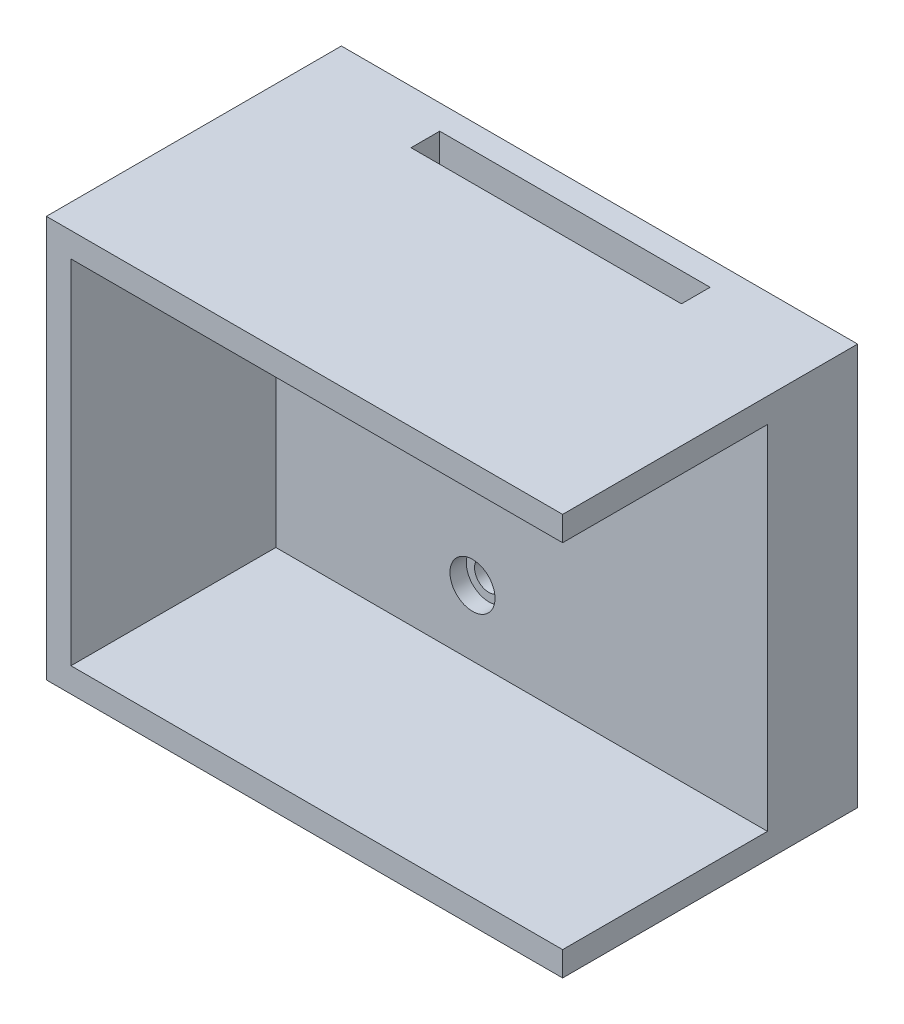
ISO-10303-21;
HEADER;
FILE_DESCRIPTION(('STEP AP214'),'2;1');
FILE_NAME('part.step','',(''),(''),'','','');
FILE_SCHEMA(('AUTOMOTIVE_DESIGN { 1 0 10303 214 1 1 1 1 }'));
ENDSEC;
DATA;
#1=APPLICATION_CONTEXT('core data for automotive mechanical design processes');
#2=APPLICATION_PROTOCOL_DEFINITION('international standard','automotive_design',2000,#1);
#3=PRODUCT_CONTEXT('',#1,'mechanical');
#4=PRODUCT('Part','Part','',(#3));
#5=PRODUCT_RELATED_PRODUCT_CATEGORY('part','',(#4));
#6=PRODUCT_DEFINITION_FORMATION('','',#4);
#7=PRODUCT_DEFINITION_CONTEXT('part definition',#1,'design');
#8=PRODUCT_DEFINITION('design','',#6,#7);
#9=PRODUCT_DEFINITION_SHAPE('','',#8);
#10=(LENGTH_UNIT() NAMED_UNIT(*) SI_UNIT(.MILLI.,.METRE.));
#11=(NAMED_UNIT(*) PLANE_ANGLE_UNIT() SI_UNIT($,.RADIAN.));
#12=(NAMED_UNIT(*) SI_UNIT($,.STERADIAN.) SOLID_ANGLE_UNIT());
#13=UNCERTAINTY_MEASURE_WITH_UNIT(LENGTH_MEASURE(1.E-05),#10,'distance_accuracy_value','');
#14=(GEOMETRIC_REPRESENTATION_CONTEXT(3) GLOBAL_UNCERTAINTY_ASSIGNED_CONTEXT((#13)) GLOBAL_UNIT_ASSIGNED_CONTEXT((#10,
#11,#12)) REPRESENTATION_CONTEXT('',''));
#15=CARTESIAN_POINT('',(0.,0.,0.));
#16=DIRECTION('',(0.,0.,1.));
#17=DIRECTION('',(1.,0.,0.));
#18=AXIS2_PLACEMENT_3D('',#15,#16,#17);
#19=CARTESIAN_POINT('',(-26.,35.,-11.));
#20=DIRECTION('',(0.,0.,1.));
#21=DIRECTION('',(1.,0.,0.));
#22=AXIS2_PLACEMENT_3D('',#19,#20,#21);
#23=CYLINDRICAL_SURFACE('',#22,1.75);
#24=CARTESIAN_POINT('',(-26.,35.,-4.5));
#25=DIRECTION('',(0.,0.,1.));
#26=DIRECTION('',(1.,0.,0.));
#27=AXIS2_PLACEMENT_3D('',#24,#25,#26);
#28=CIRCLE('',#27,1.75);
#29=CARTESIAN_POINT('',(-24.25,35.,-4.5));
#30=VERTEX_POINT('',#29);
#31=EDGE_CURVE('E207',#30,#30,#28,.F.);
#32=ORIENTED_EDGE('',*,*,#31,.T.);
#33=EDGE_LOOP('',(#32));
#34=FACE_BOUND('',#33,.T.);
#35=CARTESIAN_POINT('',(-26.,35.,-2.));
#36=DIRECTION('',(0.,0.,1.));
#37=DIRECTION('',(1.,0.,0.));
#38=AXIS2_PLACEMENT_3D('',#35,#36,#37);
#39=CIRCLE('',#38,1.75);
#40=CARTESIAN_POINT('',(-24.25,35.,-2.));
#41=VERTEX_POINT('',#40);
#42=EDGE_CURVE('E218',#41,#41,#39,.T.);
#43=ORIENTED_EDGE('',*,*,#42,.T.);
#44=EDGE_LOOP('',(#43));
#45=FACE_BOUND('',#44,.T.);
#46=ADVANCED_FACE('F43',(#34,#45),#23,.F.);
#47=CARTESIAN_POINT('',(-26.,8.,-11.));
#48=DIRECTION('',(0.,0.,1.));
#49=DIRECTION('',(1.,0.,0.));
#50=AXIS2_PLACEMENT_3D('',#47,#48,#49);
#51=CYLINDRICAL_SURFACE('',#50,1.75);
#52=CARTESIAN_POINT('',(-26.,8.,-4.5));
#53=DIRECTION('',(0.,0.,1.));
#54=DIRECTION('',(1.,0.,0.));
#55=AXIS2_PLACEMENT_3D('',#52,#53,#54);
#56=CIRCLE('',#55,1.75);
#57=CARTESIAN_POINT('',(-24.25,8.,-4.5));
#58=VERTEX_POINT('',#57);
#59=EDGE_CURVE('E47',#58,#58,#56,.F.);
#60=ORIENTED_EDGE('',*,*,#59,.T.);
#61=EDGE_LOOP('',(#60));
#62=FACE_BOUND('',#61,.T.);
#63=CARTESIAN_POINT('',(-26.,8.,-2.));
#64=DIRECTION('',(0.,0.,1.));
#65=DIRECTION('',(1.,0.,0.));
#66=AXIS2_PLACEMENT_3D('',#63,#64,#65);
#67=CIRCLE('',#66,1.75);
#68=CARTESIAN_POINT('',(-24.25,8.,-2.));
#69=VERTEX_POINT('',#68);
#70=EDGE_CURVE('E215',#69,#69,#67,.T.);
#71=ORIENTED_EDGE('',*,*,#70,.T.);
#72=EDGE_LOOP('',(#71));
#73=FACE_BOUND('',#72,.T.);
#74=ADVANCED_FACE('F317',(#62,#73),#51,.F.);
#75=CARTESIAN_POINT('',(0.,0.,25.));
#76=DIRECTION('',(0.,-1.,0.));
#77=DIRECTION('',(1.,0.,0.));
#78=AXIS2_PLACEMENT_3D('',#75,#76,#77);
#79=PLANE('',#78);
#80=DIRECTION('',(-1.,0.,0.));
#81=VECTOR('',#80,1.);
#82=CARTESIAN_POINT('',(0.,0.,0.));
#83=LINE('',#82,#81);
#84=CARTESIAN_POINT('',(10.,0.,0.));
#85=VERTEX_POINT('',#84);
#86=CARTESIAN_POINT('',(-50.,0.,0.));
#87=VERTEX_POINT('',#86);
#88=EDGE_CURVE('E242',#85,#87,#83,.T.);
#89=ORIENTED_EDGE('',*,*,#88,.T.);
#90=DIRECTION('',(0.,0.,-1.));
#91=VECTOR('',#90,1.);
#92=CARTESIAN_POINT('',(-50.,0.,25.));
#93=LINE('',#92,#91);
#94=CARTESIAN_POINT('',(-50.,0.,25.));
#95=VERTEX_POINT('',#94);
#96=EDGE_CURVE('E11',#95,#87,#93,.T.);
#97=ORIENTED_EDGE('',*,*,#96,.F.);
#98=DIRECTION('',(-1.,0.,0.));
#99=VECTOR('',#98,1.);
#100=CARTESIAN_POINT('',(0.,0.,25.));
#101=LINE('',#100,#99);
#102=CARTESIAN_POINT('',(10.,0.,25.));
#103=VERTEX_POINT('',#102);
#104=EDGE_CURVE('E243',#103,#95,#101,.T.);
#105=ORIENTED_EDGE('',*,*,#104,.F.);
#106=DIRECTION('',(0.,0.,1.));
#107=VECTOR('',#106,1.);
#108=CARTESIAN_POINT('',(10.,0.,0.));
#109=LINE('',#108,#107);
#110=EDGE_CURVE('E163',#85,#103,#109,.T.);
#111=ORIENTED_EDGE('',*,*,#110,.F.);
#112=EDGE_LOOP('',(#89,#97,#105,#111));
#113=FACE_BOUND('',#112,.T.);
#114=ADVANCED_FACE('F45',(#113),#79,.F.);
#115=CARTESIAN_POINT('',(-50.,0.,25.));
#116=DIRECTION('',(-1.,0.,0.));
#117=DIRECTION('',(0.,0.,1.));
#118=AXIS2_PLACEMENT_3D('',#115,#116,#117);
#119=PLANE('',#118);
#120=DIRECTION('',(0.,1.,0.));
#121=VECTOR('',#120,1.);
#122=CARTESIAN_POINT('',(-50.,0.,0.));
#123=LINE('',#122,#121);
#124=CARTESIAN_POINT('',(-50.,43.,0.));
#125=VERTEX_POINT('',#124);
#126=EDGE_CURVE('E254',#87,#125,#123,.T.);
#127=ORIENTED_EDGE('',*,*,#126,.T.);
#128=DIRECTION('',(0.,0.,-1.));
#129=VECTOR('',#128,1.);
#130=CARTESIAN_POINT('',(-50.,43.,25.));
#131=LINE('',#130,#129);
#132=CARTESIAN_POINT('',(-50.,43.,25.));
#133=VERTEX_POINT('',#132);
#134=EDGE_CURVE('E52',#133,#125,#131,.T.);
#135=ORIENTED_EDGE('',*,*,#134,.F.);
#136=DIRECTION('',(0.,1.,0.));
#137=VECTOR('',#136,1.);
#138=CARTESIAN_POINT('',(-50.,0.,25.));
#139=LINE('',#138,#137);
#140=EDGE_CURVE('E140',#95,#133,#139,.T.);
#141=ORIENTED_EDGE('',*,*,#140,.F.);
#142=ORIENTED_EDGE('',*,*,#96,.T.);
#143=EDGE_LOOP('',(#127,#135,#141,#142));
#144=FACE_BOUND('',#143,.T.);
#145=ADVANCED_FACE('F352',(#144),#119,.F.);
#146=CARTESIAN_POINT('',(0.,43.,25.));
#147=DIRECTION('',(0.,1.,0.));
#148=DIRECTION('',(-1.,0.,0.));
#149=AXIS2_PLACEMENT_3D('',#146,#147,#148);
#150=PLANE('',#149);
#151=DIRECTION('',(1.,0.,0.));
#152=VECTOR('',#151,1.);
#153=CARTESIAN_POINT('',(0.,43.,0.));
#154=LINE('',#153,#152);
#155=CARTESIAN_POINT('',(10.,43.,0.));
#156=VERTEX_POINT('',#155);
#157=EDGE_CURVE('E149',#125,#156,#154,.T.);
#158=ORIENTED_EDGE('',*,*,#157,.T.);
#159=DIRECTION('',(0.,0.,-1.));
#160=VECTOR('',#159,1.);
#161=CARTESIAN_POINT('',(10.,43.,25.));
#162=LINE('',#161,#160);
#163=CARTESIAN_POINT('',(10.,43.,25.));
#164=VERTEX_POINT('',#163);
#165=EDGE_CURVE('E147',#164,#156,#162,.T.);
#166=ORIENTED_EDGE('',*,*,#165,.F.);
#167=DIRECTION('',(1.,0.,0.));
#168=VECTOR('',#167,1.);
#169=CARTESIAN_POINT('',(0.,43.,25.));
#170=LINE('',#169,#168);
#171=EDGE_CURVE('E134',#133,#164,#170,.T.);
#172=ORIENTED_EDGE('',*,*,#171,.F.);
#173=ORIENTED_EDGE('',*,*,#134,.T.);
#174=EDGE_LOOP('',(#158,#166,#172,#173));
#175=FACE_BOUND('',#174,.T.);
#176=ADVANCED_FACE('F148',(#175),#150,.F.);
#177=CARTESIAN_POINT('',(0.,46.,25.));
#178=DIRECTION('',(0.,-1.,0.));
#179=DIRECTION('',(1.,0.,0.));
#180=AXIS2_PLACEMENT_3D('',#177,#178,#179);
#181=PLANE('',#180);
#182=DIRECTION('',(-1.,0.,0.));
#183=VECTOR('',#182,1.);
#184=CARTESIAN_POINT('',(-38.,46.,-4.5));
#185=LINE('',#184,#183);
#186=CARTESIAN_POINT('',(-5.,46.,-4.5));
#187=VERTEX_POINT('',#186);
#188=CARTESIAN_POINT('',(-38.,46.,-4.5));
#189=VERTEX_POINT('',#188);
#190=EDGE_CURVE('E183',#187,#189,#185,.T.);
#191=ORIENTED_EDGE('',*,*,#190,.T.);
#192=DIRECTION('',(0.,0.,-1.));
#193=VECTOR('',#192,1.);
#194=CARTESIAN_POINT('',(-38.,46.,-4.5));
#195=LINE('',#194,#193);
#196=CARTESIAN_POINT('',(-38.,46.,-8.));
#197=VERTEX_POINT('',#196);
#198=EDGE_CURVE('E175',#189,#197,#195,.T.);
#199=ORIENTED_EDGE('',*,*,#198,.T.);
#200=DIRECTION('',(1.,0.,0.));
#201=VECTOR('',#200,1.);
#202=CARTESIAN_POINT('',(-38.,46.,-8.));
#203=LINE('',#202,#201);
#204=CARTESIAN_POINT('',(-5.,46.,-8.));
#205=VERTEX_POINT('',#204);
#206=EDGE_CURVE('E178',#197,#205,#203,.T.);
#207=ORIENTED_EDGE('',*,*,#206,.T.);
#208=DIRECTION('',(0.,0.,1.));
#209=VECTOR('',#208,1.);
#210=CARTESIAN_POINT('',(-5.,46.,-4.5));
#211=LINE('',#210,#209);
#212=EDGE_CURVE('E60',#205,#187,#211,.T.);
#213=ORIENTED_EDGE('',*,*,#212,.T.);
#214=EDGE_LOOP('',(#191,#199,#207,#213));
#215=FACE_BOUND('',#214,.T.);
#216=DIRECTION('',(-1.,0.,0.));
#217=VECTOR('',#216,1.);
#218=CARTESIAN_POINT('',(0.,46.,25.));
#219=LINE('',#218,#217);
#220=CARTESIAN_POINT('',(10.,46.,25.));
#221=VERTEX_POINT('',#220);
#222=CARTESIAN_POINT('',(-53.,46.,25.));
#223=VERTEX_POINT('',#222);
#224=EDGE_CURVE('E144',#221,#223,#219,.T.);
#225=ORIENTED_EDGE('',*,*,#224,.F.);
#226=DIRECTION('',(0.,0.,1.));
#227=VECTOR('',#226,1.);
#228=CARTESIAN_POINT('',(10.,46.,-11.));
#229=LINE('',#228,#227);
#230=CARTESIAN_POINT('',(10.,46.,-11.));
#231=VERTEX_POINT('',#230);
#232=EDGE_CURVE('E159',#231,#221,#229,.T.);
#233=ORIENTED_EDGE('',*,*,#232,.F.);
#234=DIRECTION('',(1.,0.,0.));
#235=VECTOR('',#234,1.);
#236=CARTESIAN_POINT('',(0.,46.,-11.));
#237=LINE('',#236,#235);
#238=CARTESIAN_POINT('',(-53.,46.,-11.));
#239=VERTEX_POINT('',#238);
#240=EDGE_CURVE('E240',#239,#231,#237,.T.);
#241=ORIENTED_EDGE('',*,*,#240,.F.);
#242=DIRECTION('',(0.,0.,-1.));
#243=VECTOR('',#242,1.);
#244=CARTESIAN_POINT('',(-53.,46.,25.));
#245=LINE('',#244,#243);
#246=EDGE_CURVE('E259',#223,#239,#245,.T.);
#247=ORIENTED_EDGE('',*,*,#246,.F.);
#248=EDGE_LOOP('',(#225,#233,#241,#247));
#249=FACE_BOUND('',#248,.T.);
#250=ADVANCED_FACE('F297',(#215,#249),#181,.F.);
#251=CARTESIAN_POINT('',(-53.,46.,25.));
#252=DIRECTION('',(1.,0.,0.));
#253=DIRECTION('',(0.,1.,0.));
#254=AXIS2_PLACEMENT_3D('',#251,#252,#253);
#255=PLANE('',#254);
#256=ORIENTED_EDGE('',*,*,#246,.T.);
#257=DIRECTION('',(0.,1.,0.));
#258=VECTOR('',#257,1.);
#259=CARTESIAN_POINT('',(-53.,46.,-11.));
#260=LINE('',#259,#258);
#261=CARTESIAN_POINT('',(-53.,-3.,-11.));
#262=VERTEX_POINT('',#261);
#263=EDGE_CURVE('E237',#262,#239,#260,.T.);
#264=ORIENTED_EDGE('',*,*,#263,.F.);
#265=DIRECTION('',(0.,0.,-1.));
#266=VECTOR('',#265,1.);
#267=CARTESIAN_POINT('',(-53.,-3.,25.));
#268=LINE('',#267,#266);
#269=CARTESIAN_POINT('',(-53.,-3.,25.));
#270=VERTEX_POINT('',#269);
#271=EDGE_CURVE('E251',#270,#262,#268,.T.);
#272=ORIENTED_EDGE('',*,*,#271,.F.);
#273=DIRECTION('',(0.,-1.,0.));
#274=VECTOR('',#273,1.);
#275=CARTESIAN_POINT('',(-53.,46.,25.));
#276=LINE('',#275,#274);
#277=EDGE_CURVE('E247',#223,#270,#276,.T.);
#278=ORIENTED_EDGE('',*,*,#277,.F.);
#279=EDGE_LOOP('',(#256,#264,#272,#278));
#280=FACE_BOUND('',#279,.T.);
#281=ADVANCED_FACE('F303',(#280),#255,.F.);
#282=CARTESIAN_POINT('',(-53.,-3.,25.));
#283=DIRECTION('',(0.,1.,0.));
#284=DIRECTION('',(0.,0.,1.));
#285=AXIS2_PLACEMENT_3D('',#282,#283,#284);
#286=PLANE('',#285);
#287=DIRECTION('',(1.,0.,0.));
#288=VECTOR('',#287,1.);
#289=CARTESIAN_POINT('',(-38.,-3.,-8.));
#290=LINE('',#289,#288);
#291=CARTESIAN_POINT('',(-38.,-3.,-8.));
#292=VERTEX_POINT('',#291);
#293=CARTESIAN_POINT('',(-5.,-3.,-8.));
#294=VERTEX_POINT('',#293);
#295=EDGE_CURVE('E188',#292,#294,#290,.T.);
#296=ORIENTED_EDGE('',*,*,#295,.F.);
#297=DIRECTION('',(0.,0.,-1.));
#298=VECTOR('',#297,1.);
#299=CARTESIAN_POINT('',(-38.,-3.,-4.5));
#300=LINE('',#299,#298);
#301=CARTESIAN_POINT('',(-38.,-3.,-4.5));
#302=VERTEX_POINT('',#301);
#303=EDGE_CURVE('E68',#302,#292,#300,.T.);
#304=ORIENTED_EDGE('',*,*,#303,.F.);
#305=DIRECTION('',(-1.,0.,0.));
#306=VECTOR('',#305,1.);
#307=CARTESIAN_POINT('',(-38.,-3.,-4.5));
#308=LINE('',#307,#306);
#309=CARTESIAN_POINT('',(-5.,-3.,-4.5));
#310=VERTEX_POINT('',#309);
#311=EDGE_CURVE('E179',#310,#302,#308,.T.);
#312=ORIENTED_EDGE('',*,*,#311,.F.);
#313=DIRECTION('',(0.,0.,1.));
#314=VECTOR('',#313,1.);
#315=CARTESIAN_POINT('',(-5.,-3.,-4.5));
#316=LINE('',#315,#314);
#317=EDGE_CURVE('E191',#294,#310,#316,.T.);
#318=ORIENTED_EDGE('',*,*,#317,.F.);
#319=EDGE_LOOP('',(#296,#304,#312,#318));
#320=FACE_BOUND('',#319,.T.);
#321=ORIENTED_EDGE('',*,*,#271,.T.);
#322=DIRECTION('',(-1.,0.,0.));
#323=VECTOR('',#322,1.);
#324=CARTESIAN_POINT('',(0.,-3.,-11.));
#325=LINE('',#324,#323);
#326=CARTESIAN_POINT('',(10.,-3.,-11.));
#327=VERTEX_POINT('',#326);
#328=EDGE_CURVE('E226',#327,#262,#325,.T.);
#329=ORIENTED_EDGE('',*,*,#328,.F.);
#330=DIRECTION('',(0.,0.,-1.));
#331=VECTOR('',#330,1.);
#332=CARTESIAN_POINT('',(10.,-3.,25.));
#333=LINE('',#332,#331);
#334=CARTESIAN_POINT('',(10.,-3.,25.));
#335=VERTEX_POINT('',#334);
#336=EDGE_CURVE('E169',#335,#327,#333,.T.);
#337=ORIENTED_EDGE('',*,*,#336,.F.);
#338=DIRECTION('',(1.,0.,0.));
#339=VECTOR('',#338,1.);
#340=CARTESIAN_POINT('',(-53.,-3.,25.));
#341=LINE('',#340,#339);
#342=EDGE_CURVE('E249',#270,#335,#341,.T.);
#343=ORIENTED_EDGE('',*,*,#342,.F.);
#344=EDGE_LOOP('',(#321,#329,#337,#343));
#345=FACE_BOUND('',#344,.T.);
#346=ADVANCED_FACE('F305',(#320,#345),#286,.F.);
#347=CARTESIAN_POINT('',(0.,0.,25.));
#348=DIRECTION('',(0.,0.,1.));
#349=DIRECTION('',(1.,0.,0.));
#350=AXIS2_PLACEMENT_3D('',#347,#348,#349);
#351=PLANE('',#350);
#352=ORIENTED_EDGE('',*,*,#342,.T.);
#353=DIRECTION('',(0.,-1.,0.));
#354=VECTOR('',#353,1.);
#355=CARTESIAN_POINT('',(10.,0.,25.));
#356=LINE('',#355,#354);
#357=EDGE_CURVE('E166',#103,#335,#356,.T.);
#358=ORIENTED_EDGE('',*,*,#357,.F.);
#359=ORIENTED_EDGE('',*,*,#104,.T.);
#360=ORIENTED_EDGE('',*,*,#140,.T.);
#361=ORIENTED_EDGE('',*,*,#171,.T.);
#362=DIRECTION('',(0.,-1.,0.));
#363=VECTOR('',#362,1.);
#364=CARTESIAN_POINT('',(10.,46.,25.));
#365=LINE('',#364,#363);
#366=EDGE_CURVE('E138',#221,#164,#365,.T.);
#367=ORIENTED_EDGE('',*,*,#366,.F.);
#368=ORIENTED_EDGE('',*,*,#224,.T.);
#369=ORIENTED_EDGE('',*,*,#277,.T.);
#370=EDGE_LOOP('',(#352,#358,#359,#360,#361,#367,#368,#369));
#371=FACE_BOUND('',#370,.T.);
#372=ADVANCED_FACE('F136',(#371),#351,.T.);
#373=CARTESIAN_POINT('',(0.,0.,-11.));
#374=DIRECTION('',(0.,0.,-1.));
#375=DIRECTION('',(-1.,0.,0.));
#376=AXIS2_PLACEMENT_3D('',#373,#374,#375);
#377=PLANE('',#376);
#378=CARTESIAN_POINT('',(-26.,8.,-11.));
#379=DIRECTION('',(0.,0.,1.));
#380=DIRECTION('',(1.,0.,0.));
#381=AXIS2_PLACEMENT_3D('',#378,#379,#380);
#382=CIRCLE('',#381,1.75);
#383=CARTESIAN_POINT('',(-24.25,8.,-11.));
#384=VERTEX_POINT('',#383);
#385=EDGE_CURVE('E211',#384,#384,#382,.T.);
#386=ORIENTED_EDGE('',*,*,#385,.T.);
#387=EDGE_LOOP('',(#386));
#388=FACE_BOUND('',#387,.T.);
#389=CARTESIAN_POINT('',(-26.,35.,-11.));
#390=DIRECTION('',(0.,0.,1.));
#391=DIRECTION('',(1.,0.,0.));
#392=AXIS2_PLACEMENT_3D('',#389,#390,#391);
#393=CIRCLE('',#392,1.75);
#394=CARTESIAN_POINT('',(-24.25,35.,-11.));
#395=VERTEX_POINT('',#394);
#396=EDGE_CURVE('E210',#395,#395,#393,.T.);
#397=ORIENTED_EDGE('',*,*,#396,.T.);
#398=EDGE_LOOP('',(#397));
#399=FACE_BOUND('',#398,.T.);
#400=ORIENTED_EDGE('',*,*,#240,.T.);
#401=DIRECTION('',(0.,1.,0.));
#402=VECTOR('',#401,1.);
#403=CARTESIAN_POINT('',(10.,-3.,-11.));
#404=LINE('',#403,#402);
#405=EDGE_CURVE('E172',#327,#231,#404,.T.);
#406=ORIENTED_EDGE('',*,*,#405,.F.);
#407=ORIENTED_EDGE('',*,*,#328,.T.);
#408=ORIENTED_EDGE('',*,*,#263,.T.);
#409=EDGE_LOOP('',(#400,#406,#407,#408));
#410=FACE_BOUND('',#409,.T.);
#411=ADVANCED_FACE('F285',(#388,#399,#410),#377,.T.);
#412=CARTESIAN_POINT('',(0.,0.,0.));
#413=DIRECTION('',(0.,0.,-1.));
#414=DIRECTION('',(-1.,0.,0.));
#415=AXIS2_PLACEMENT_3D('',#412,#413,#414);
#416=PLANE('',#415);
#417=CARTESIAN_POINT('',(-26.,35.,0.));
#418=DIRECTION('',(0.,0.,1.));
#419=DIRECTION('',(1.,0.,0.));
#420=AXIS2_PLACEMENT_3D('',#417,#418,#419);
#421=CIRCLE('',#420,2.75);
#422=CARTESIAN_POINT('',(-23.25,35.,0.));
#423=VERTEX_POINT('',#422);
#424=EDGE_CURVE('E227',#423,#423,#421,.T.);
#425=ORIENTED_EDGE('',*,*,#424,.F.);
#426=EDGE_LOOP('',(#425));
#427=FACE_BOUND('',#426,.T.);
#428=CARTESIAN_POINT('',(-26.,8.,0.));
#429=DIRECTION('',(0.,0.,1.));
#430=DIRECTION('',(1.,0.,0.));
#431=AXIS2_PLACEMENT_3D('',#428,#429,#430);
#432=CIRCLE('',#431,2.75);
#433=CARTESIAN_POINT('',(-23.25,8.,0.));
#434=VERTEX_POINT('',#433);
#435=EDGE_CURVE('E230',#434,#434,#432,.T.);
#436=ORIENTED_EDGE('',*,*,#435,.F.);
#437=EDGE_LOOP('',(#436));
#438=FACE_BOUND('',#437,.T.);
#439=ORIENTED_EDGE('',*,*,#157,.F.);
#440=ORIENTED_EDGE('',*,*,#126,.F.);
#441=ORIENTED_EDGE('',*,*,#88,.F.);
#442=DIRECTION('',(0.,-1.,0.));
#443=VECTOR('',#442,1.);
#444=CARTESIAN_POINT('',(10.,43.,0.));
#445=LINE('',#444,#443);
#446=EDGE_CURVE('E153',#156,#85,#445,.T.);
#447=ORIENTED_EDGE('',*,*,#446,.F.);
#448=EDGE_LOOP('',(#439,#440,#441,#447));
#449=FACE_BOUND('',#448,.T.);
#450=ADVANCED_FACE('F288',(#427,#438,#449),#416,.F.);
#451=CARTESIAN_POINT('',(-26.,8.,-2.));
#452=DIRECTION('',(0.,0.,1.));
#453=DIRECTION('',(1.,0.,0.));
#454=AXIS2_PLACEMENT_3D('',#451,#452,#453);
#455=CYLINDRICAL_SURFACE('',#454,2.75);
#456=CARTESIAN_POINT('',(-26.,8.,-2.));
#457=DIRECTION('',(0.,0.,1.));
#458=DIRECTION('',(1.,0.,0.));
#459=AXIS2_PLACEMENT_3D('',#456,#457,#458);
#460=CIRCLE('',#459,2.75);
#461=CARTESIAN_POINT('',(-23.25,8.,-2.));
#462=VERTEX_POINT('',#461);
#463=EDGE_CURVE('E214',#462,#462,#460,.T.);
#464=ORIENTED_EDGE('',*,*,#463,.F.);
#465=EDGE_LOOP('',(#464));
#466=FACE_BOUND('',#465,.T.);
#467=ORIENTED_EDGE('',*,*,#435,.T.);
#468=EDGE_LOOP('',(#467));
#469=FACE_BOUND('',#468,.T.);
#470=ADVANCED_FACE('F335',(#466,#469),#455,.F.);
#471=CARTESIAN_POINT('',(-26.,8.,-2.));
#472=DIRECTION('',(0.,0.,1.));
#473=DIRECTION('',(1.,0.,0.));
#474=AXIS2_PLACEMENT_3D('',#471,#472,#473);
#475=PLANE('',#474);
#476=ORIENTED_EDGE('',*,*,#70,.F.);
#477=EDGE_LOOP('',(#476));
#478=FACE_BOUND('',#477,.T.);
#479=ORIENTED_EDGE('',*,*,#463,.T.);
#480=EDGE_LOOP('',(#479));
#481=FACE_BOUND('',#480,.T.);
#482=ADVANCED_FACE('F333',(#478,#481),#475,.T.);
#483=CARTESIAN_POINT('',(-26.,35.,-2.));
#484=DIRECTION('',(0.,0.,1.));
#485=DIRECTION('',(1.,0.,0.));
#486=AXIS2_PLACEMENT_3D('',#483,#484,#485);
#487=CYLINDRICAL_SURFACE('',#486,2.75);
#488=CARTESIAN_POINT('',(-26.,35.,-2.));
#489=DIRECTION('',(0.,0.,1.));
#490=DIRECTION('',(1.,0.,0.));
#491=AXIS2_PLACEMENT_3D('',#488,#489,#490);
#492=CIRCLE('',#491,2.75);
#493=CARTESIAN_POINT('',(-23.25,35.,-2.));
#494=VERTEX_POINT('',#493);
#495=EDGE_CURVE('E223',#494,#494,#492,.T.);
#496=ORIENTED_EDGE('',*,*,#495,.F.);
#497=EDGE_LOOP('',(#496));
#498=FACE_BOUND('',#497,.T.);
#499=ORIENTED_EDGE('',*,*,#424,.T.);
#500=EDGE_LOOP('',(#499));
#501=FACE_BOUND('',#500,.T.);
#502=ADVANCED_FACE('F329',(#498,#501),#487,.F.);
#503=CARTESIAN_POINT('',(-26.,35.,-2.));
#504=DIRECTION('',(0.,0.,1.));
#505=DIRECTION('',(1.,0.,0.));
#506=AXIS2_PLACEMENT_3D('',#503,#504,#505);
#507=PLANE('',#506);
#508=ORIENTED_EDGE('',*,*,#42,.F.);
#509=EDGE_LOOP('',(#508));
#510=FACE_BOUND('',#509,.T.);
#511=ORIENTED_EDGE('',*,*,#495,.T.);
#512=EDGE_LOOP('',(#511));
#513=FACE_BOUND('',#512,.T.);
#514=ADVANCED_FACE('F281',(#510,#513),#507,.T.);
#515=CARTESIAN_POINT('',(-26.,35.,-8.));
#516=DIRECTION('',(0.,0.,-1.));
#517=DIRECTION('',(-1.,0.,0.));
#518=AXIS2_PLACEMENT_3D('',#515,#516,#517);
#519=CIRCLE('',#518,1.75);
#520=CARTESIAN_POINT('',(-27.75,35.,-8.));
#521=VERTEX_POINT('',#520);
#522=EDGE_CURVE('E204',#521,#521,#519,.F.);
#523=ORIENTED_EDGE('',*,*,#522,.T.);
#524=EDGE_LOOP('',(#523));
#525=FACE_BOUND('',#524,.T.);
#526=ORIENTED_EDGE('',*,*,#396,.F.);
#527=EDGE_LOOP('',(#526));
#528=FACE_BOUND('',#527,.T.);
#529=ADVANCED_FACE('F278',(#525,#528),#23,.F.);
#530=CARTESIAN_POINT('',(-26.,8.,-8.));
#531=DIRECTION('',(0.,0.,-1.));
#532=DIRECTION('',(-1.,0.,0.));
#533=AXIS2_PLACEMENT_3D('',#530,#531,#532);
#534=CIRCLE('',#533,1.75);
#535=CARTESIAN_POINT('',(-27.75,8.,-8.));
#536=VERTEX_POINT('',#535);
#537=EDGE_CURVE('E198',#536,#536,#534,.F.);
#538=ORIENTED_EDGE('',*,*,#537,.T.);
#539=EDGE_LOOP('',(#538));
#540=FACE_BOUND('',#539,.T.);
#541=ORIENTED_EDGE('',*,*,#385,.F.);
#542=EDGE_LOOP('',(#541));
#543=FACE_BOUND('',#542,.T.);
#544=ADVANCED_FACE('F264',(#540,#543),#51,.F.);
#545=CARTESIAN_POINT('',(-38.,46.,-4.5));
#546=DIRECTION('',(0.,0.,1.));
#547=DIRECTION('',(1.,0.,0.));
#548=AXIS2_PLACEMENT_3D('',#545,#546,#547);
#549=PLANE('',#548);
#550=ORIENTED_EDGE('',*,*,#59,.F.);
#551=EDGE_LOOP('',(#550));
#552=FACE_BOUND('',#551,.T.);
#553=ORIENTED_EDGE('',*,*,#311,.T.);
#554=DIRECTION('',(0.,-1.,0.));
#555=VECTOR('',#554,1.);
#556=CARTESIAN_POINT('',(-38.,46.,-4.5));
#557=LINE('',#556,#555);
#558=EDGE_CURVE('E196',#189,#302,#557,.T.);
#559=ORIENTED_EDGE('',*,*,#558,.F.);
#560=ORIENTED_EDGE('',*,*,#190,.F.);
#561=DIRECTION('',(0.,-1.,0.));
#562=VECTOR('',#561,1.);
#563=CARTESIAN_POINT('',(-5.,46.,-4.5));
#564=LINE('',#563,#562);
#565=EDGE_CURVE('E199',#187,#310,#564,.T.);
#566=ORIENTED_EDGE('',*,*,#565,.T.);
#567=EDGE_LOOP('',(#553,#559,#560,#566));
#568=FACE_BOUND('',#567,.T.);
#569=ORIENTED_EDGE('',*,*,#31,.F.);
#570=EDGE_LOOP('',(#569));
#571=FACE_BOUND('',#570,.T.);
#572=ADVANCED_FACE('F271',(#552,#568,#571),#549,.F.);
#573=CARTESIAN_POINT('',(-38.,46.,-8.));
#574=DIRECTION('',(0.,0.,-1.));
#575=DIRECTION('',(-1.,0.,0.));
#576=AXIS2_PLACEMENT_3D('',#573,#574,#575);
#577=PLANE('',#576);
#578=ORIENTED_EDGE('',*,*,#537,.F.);
#579=EDGE_LOOP('',(#578));
#580=FACE_BOUND('',#579,.T.);
#581=ORIENTED_EDGE('',*,*,#295,.T.);
#582=DIRECTION('',(0.,-1.,0.));
#583=VECTOR('',#582,1.);
#584=CARTESIAN_POINT('',(-5.,46.,-8.));
#585=LINE('',#584,#583);
#586=EDGE_CURVE('E201',#205,#294,#585,.T.);
#587=ORIENTED_EDGE('',*,*,#586,.F.);
#588=ORIENTED_EDGE('',*,*,#206,.F.);
#589=DIRECTION('',(0.,-1.,0.));
#590=VECTOR('',#589,1.);
#591=CARTESIAN_POINT('',(-38.,46.,-8.));
#592=LINE('',#591,#590);
#593=EDGE_CURVE('E186',#197,#292,#592,.T.);
#594=ORIENTED_EDGE('',*,*,#593,.T.);
#595=EDGE_LOOP('',(#581,#587,#588,#594));
#596=FACE_BOUND('',#595,.T.);
#597=ORIENTED_EDGE('',*,*,#522,.F.);
#598=EDGE_LOOP('',(#597));
#599=FACE_BOUND('',#598,.T.);
#600=ADVANCED_FACE('F267',(#580,#596,#599),#577,.F.);
#601=CARTESIAN_POINT('',(-38.,46.,-4.5));
#602=DIRECTION('',(-1.,0.,0.));
#603=DIRECTION('',(0.,0.,1.));
#604=AXIS2_PLACEMENT_3D('',#601,#602,#603);
#605=PLANE('',#604);
#606=ORIENTED_EDGE('',*,*,#303,.T.);
#607=ORIENTED_EDGE('',*,*,#593,.F.);
#608=ORIENTED_EDGE('',*,*,#198,.F.);
#609=ORIENTED_EDGE('',*,*,#558,.T.);
#610=EDGE_LOOP('',(#606,#607,#608,#609));
#611=FACE_BOUND('',#610,.T.);
#612=ADVANCED_FACE('F270',(#611),#605,.F.);
#613=CARTESIAN_POINT('',(-5.,46.,-4.5));
#614=DIRECTION('',(1.,0.,0.));
#615=DIRECTION('',(0.,0.,-1.));
#616=AXIS2_PLACEMENT_3D('',#613,#614,#615);
#617=PLANE('',#616);
#618=ORIENTED_EDGE('',*,*,#317,.T.);
#619=ORIENTED_EDGE('',*,*,#565,.F.);
#620=ORIENTED_EDGE('',*,*,#212,.F.);
#621=ORIENTED_EDGE('',*,*,#586,.T.);
#622=EDGE_LOOP('',(#618,#619,#620,#621));
#623=FACE_BOUND('',#622,.T.);
#624=ADVANCED_FACE('F375',(#623),#617,.F.);
#625=CARTESIAN_POINT('',(10.,0.,0.));
#626=DIRECTION('',(1.,0.,0.));
#627=DIRECTION('',(0.,0.,-1.));
#628=AXIS2_PLACEMENT_3D('',#625,#626,#627);
#629=PLANE('',#628);
#630=ORIENTED_EDGE('',*,*,#366,.T.);
#631=ORIENTED_EDGE('',*,*,#165,.T.);
#632=ORIENTED_EDGE('',*,*,#446,.T.);
#633=ORIENTED_EDGE('',*,*,#110,.T.);
#634=ORIENTED_EDGE('',*,*,#357,.T.);
#635=ORIENTED_EDGE('',*,*,#336,.T.);
#636=ORIENTED_EDGE('',*,*,#405,.T.);
#637=ORIENTED_EDGE('',*,*,#232,.T.);
#638=EDGE_LOOP('',(#630,#631,#632,#633,#634,#635,#636,#637));
#639=FACE_BOUND('',#638,.T.);
#640=ADVANCED_FACE('F156',(#639),#629,.T.);
#641=CLOSED_SHELL('',(#46,#74,#114,#145,#176,#250,#281,#346,#372,#411,#450,#470,#482,#502,#514,
#529,#544,#572,#600,#612,#624,#640));
#642=MANIFOLD_SOLID_BREP('B2',#641);
#643=ADVANCED_BREP_SHAPE_REPRESENTATION('',(#18,#642),#14);
#644=SHAPE_DEFINITION_REPRESENTATION(#9,#643);
ENDSEC;
END-ISO-10303-21;
